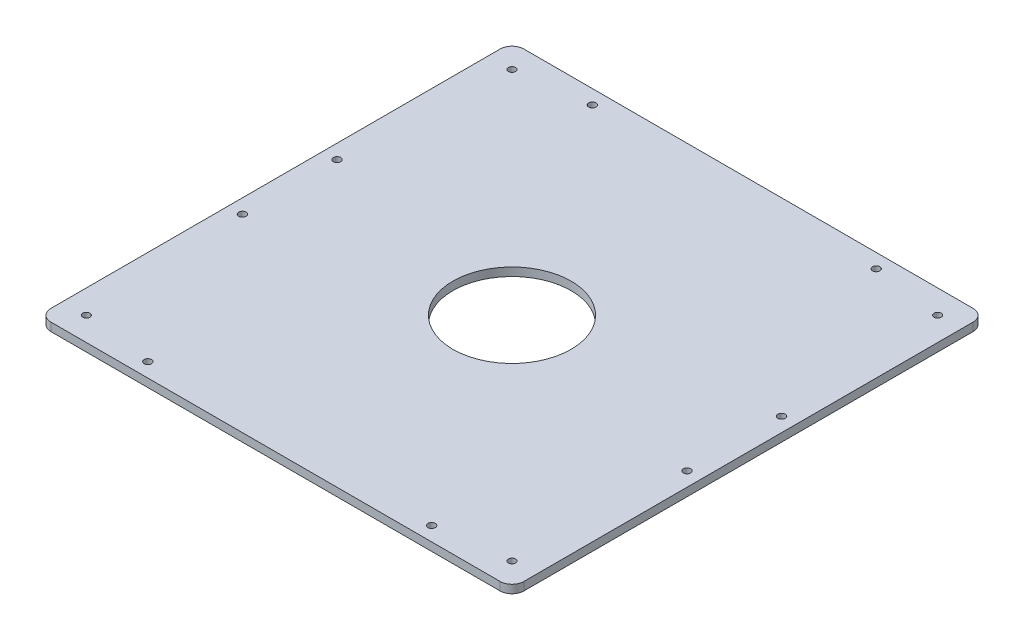
ISO-10303-21;
HEADER;
FILE_DESCRIPTION(('STEP AP214'),'2;1');
FILE_NAME('part.step','',(''),(''),'','','');
FILE_SCHEMA(('AUTOMOTIVE_DESIGN { 1 0 10303 214 1 1 1 1 }'));
ENDSEC;
DATA;
#1=APPLICATION_CONTEXT('core data for automotive mechanical design processes');
#2=APPLICATION_PROTOCOL_DEFINITION('international standard','automotive_design',2000,#1);
#3=PRODUCT_CONTEXT('',#1,'mechanical');
#4=PRODUCT('Part','Part','',(#3));
#5=PRODUCT_RELATED_PRODUCT_CATEGORY('part','',(#4));
#6=PRODUCT_DEFINITION_FORMATION('','',#4);
#7=PRODUCT_DEFINITION_CONTEXT('part definition',#1,'design');
#8=PRODUCT_DEFINITION('design','',#6,#7);
#9=PRODUCT_DEFINITION_SHAPE('','',#8);
#10=(LENGTH_UNIT() NAMED_UNIT(*) SI_UNIT(.MILLI.,.METRE.));
#11=(NAMED_UNIT(*) PLANE_ANGLE_UNIT() SI_UNIT($,.RADIAN.));
#12=(NAMED_UNIT(*) SI_UNIT($,.STERADIAN.) SOLID_ANGLE_UNIT());
#13=UNCERTAINTY_MEASURE_WITH_UNIT(LENGTH_MEASURE(1.E-05),#10,'distance_accuracy_value','');
#14=(GEOMETRIC_REPRESENTATION_CONTEXT(3) GLOBAL_UNCERTAINTY_ASSIGNED_CONTEXT((#13)) GLOBAL_UNIT_ASSIGNED_CONTEXT((#10,
#11,#12)) REPRESENTATION_CONTEXT('',''));
#15=CARTESIAN_POINT('',(0.,0.,0.));
#16=DIRECTION('',(0.,0.,1.));
#17=DIRECTION('',(1.,0.,0.));
#18=AXIS2_PLACEMENT_3D('',#15,#16,#17);
#19=CARTESIAN_POINT('',(0.,3.5,0.));
#20=DIRECTION('',(0.,1.,0.));
#21=DIRECTION('',(0.,0.,1.));
#22=AXIS2_PLACEMENT_3D('',#19,#20,#21);
#23=PLANE('',#22);
#24=CARTESIAN_POINT('',(-94.,3.5,-20.));
#25=DIRECTION('',(0.,1.,0.));
#26=DIRECTION('',(0.,0.,-1.));
#27=AXIS2_PLACEMENT_3D('',#24,#25,#26);
#28=CIRCLE('',#27,1.54999999999999);
#29=CARTESIAN_POINT('',(-94.,3.5,-21.55));
#30=VERTEX_POINT('',#29);
#31=EDGE_CURVE('E295',#30,#30,#28,.T.);
#32=ORIENTED_EDGE('',*,*,#31,.F.);
#33=EDGE_LOOP('',(#32));
#34=FACE_BOUND('',#33,.T.);
#35=CARTESIAN_POINT('',(-60.,3.5,94.));
#36=DIRECTION('',(0.,1.,0.));
#37=DIRECTION('',(0.,0.,-1.));
#38=AXIS2_PLACEMENT_3D('',#35,#36,#37);
#39=CIRCLE('',#38,1.54999999999999);
#40=CARTESIAN_POINT('',(-60.,3.5,92.45));
#41=VERTEX_POINT('',#40);
#42=EDGE_CURVE('E311',#41,#41,#39,.T.);
#43=ORIENTED_EDGE('',*,*,#42,.F.);
#44=EDGE_LOOP('',(#43));
#45=FACE_BOUND('',#44,.T.);
#46=CARTESIAN_POINT('',(94.,3.5,-20.));
#47=DIRECTION('',(0.,1.,0.));
#48=DIRECTION('',(0.,0.,1.));
#49=AXIS2_PLACEMENT_3D('',#46,#47,#48);
#50=CIRCLE('',#49,1.54999999999999);
#51=CARTESIAN_POINT('',(94.,3.5,-18.45));
#52=VERTEX_POINT('',#51);
#53=EDGE_CURVE('E327',#52,#52,#50,.T.);
#54=ORIENTED_EDGE('',*,*,#53,.F.);
#55=EDGE_LOOP('',(#54));
#56=FACE_BOUND('',#55,.T.);
#57=CARTESIAN_POINT('',(60.,3.5,-94.));
#58=DIRECTION('',(0.,1.,0.));
#59=DIRECTION('',(0.,0.,1.));
#60=AXIS2_PLACEMENT_3D('',#57,#58,#59);
#61=CIRCLE('',#60,1.55);
#62=CARTESIAN_POINT('',(60.,3.5,-92.45));
#63=VERTEX_POINT('',#62);
#64=EDGE_CURVE('E343',#63,#63,#61,.T.);
#65=ORIENTED_EDGE('',*,*,#64,.F.);
#66=EDGE_LOOP('',(#65));
#67=FACE_BOUND('',#66,.T.);
#68=CARTESIAN_POINT('',(90.,3.5,-90.));
#69=DIRECTION('',(0.,1.,0.));
#70=DIRECTION('',(0.,0.,1.));
#71=AXIS2_PLACEMENT_3D('',#68,#69,#70);
#72=CIRCLE('',#71,1.5);
#73=CARTESIAN_POINT('',(90.,3.5,-88.5));
#74=VERTEX_POINT('',#73);
#75=EDGE_CURVE('E359',#74,#74,#72,.T.);
#76=ORIENTED_EDGE('',*,*,#75,.F.);
#77=EDGE_LOOP('',(#76));
#78=FACE_BOUND('',#77,.T.);
#79=CARTESIAN_POINT('',(-90.,3.5,90.));
#80=DIRECTION('',(0.,1.,0.));
#81=DIRECTION('',(0.,0.,1.));
#82=AXIS2_PLACEMENT_3D('',#79,#80,#81);
#83=CIRCLE('',#82,1.5);
#84=CARTESIAN_POINT('',(-90.,3.5,91.5));
#85=VERTEX_POINT('',#84);
#86=EDGE_CURVE('E375',#85,#85,#83,.T.);
#87=ORIENTED_EDGE('',*,*,#86,.F.);
#88=EDGE_LOOP('',(#87));
#89=FACE_BOUND('',#88,.T.);
#90=DIRECTION('',(0.,0.,-1.));
#91=VECTOR('',#90,1.);
#92=CARTESIAN_POINT('',(99.9999999999982,3.5,80.6875383750505));
#93=LINE('',#92,#91);
#94=CARTESIAN_POINT('',(99.9999999999995,3.5,95.0000000000001));
#95=VERTEX_POINT('',#94);
#96=CARTESIAN_POINT('',(99.9999999999814,3.5,-95.));
#97=VERTEX_POINT('',#96);
#98=EDGE_CURVE('E183',#95,#97,#93,.T.);
#99=ORIENTED_EDGE('',*,*,#98,.T.);
#100=CARTESIAN_POINT('',(94.9999999999999,3.5,-95.));
#101=DIRECTION('',(0.,1.,0.));
#102=DIRECTION('',(0.,0.,1.));
#103=AXIS2_PLACEMENT_3D('',#100,#101,#102);
#104=CIRCLE('',#103,5.);
#105=CARTESIAN_POINT('',(94.9999999999999,3.5,-100.));
#106=VERTEX_POINT('',#105);
#107=EDGE_CURVE('E171',#97,#106,#104,.T.);
#108=ORIENTED_EDGE('',*,*,#107,.T.);
#109=DIRECTION('',(-1.,0.,0.));
#110=VECTOR('',#109,1.);
#111=CARTESIAN_POINT('',(-100.,3.5,-100.));
#112=LINE('',#111,#110);
#113=CARTESIAN_POINT('',(-94.9999999999999,3.5,-100.));
#114=VERTEX_POINT('',#113);
#115=EDGE_CURVE('E129',#106,#114,#112,.T.);
#116=ORIENTED_EDGE('',*,*,#115,.T.);
#117=CARTESIAN_POINT('',(-94.9999999999999,3.5,-95.));
#118=DIRECTION('',(0.,1.,0.));
#119=DIRECTION('',(0.,0.,1.));
#120=AXIS2_PLACEMENT_3D('',#117,#118,#119);
#121=CIRCLE('',#120,5.);
#122=CARTESIAN_POINT('',(-100.,3.5,-95.));
#123=VERTEX_POINT('',#122);
#124=EDGE_CURVE('E168',#114,#123,#121,.T.);
#125=ORIENTED_EDGE('',*,*,#124,.T.);
#126=DIRECTION('',(0.,0.,1.));
#127=VECTOR('',#126,1.);
#128=CARTESIAN_POINT('',(-100.,3.5,-100.));
#129=LINE('',#128,#127);
#130=CARTESIAN_POINT('',(-100.,3.5,95.));
#131=VERTEX_POINT('',#130);
#132=EDGE_CURVE('E138',#123,#131,#129,.T.);
#133=ORIENTED_EDGE('',*,*,#132,.T.);
#134=CARTESIAN_POINT('',(-95.,3.5,95.));
#135=DIRECTION('',(0.,1.,0.));
#136=DIRECTION('',(0.,0.,1.));
#137=AXIS2_PLACEMENT_3D('',#134,#135,#136);
#138=CIRCLE('',#137,5.);
#139=CARTESIAN_POINT('',(-95.,3.5,100.));
#140=VERTEX_POINT('',#139);
#141=EDGE_CURVE('E63',#131,#140,#138,.T.);
#142=ORIENTED_EDGE('',*,*,#141,.T.);
#143=DIRECTION('',(1.,0.,0.));
#144=VECTOR('',#143,1.);
#145=CARTESIAN_POINT('',(-100.,3.5,100.));
#146=LINE('',#145,#144);
#147=CARTESIAN_POINT('',(94.9999999999973,3.5,100.));
#148=VERTEX_POINT('',#147);
#149=EDGE_CURVE('E143',#140,#148,#146,.T.);
#150=ORIENTED_EDGE('',*,*,#149,.T.);
#151=CARTESIAN_POINT('',(94.9999999999973,3.5,95.));
#152=DIRECTION('',(0.,1.,0.));
#153=DIRECTION('',(0.,0.,1.));
#154=AXIS2_PLACEMENT_3D('',#151,#152,#153);
#155=CIRCLE('',#154,5.);
#156=EDGE_CURVE('E163',#148,#95,#155,.T.);
#157=ORIENTED_EDGE('',*,*,#156,.T.);
#158=EDGE_LOOP('',(#99,#108,#116,#125,#133,#142,#150,#157));
#159=FACE_BOUND('',#158,.T.);
#160=CARTESIAN_POINT('',(0.,3.5,0.));
#161=DIRECTION('',(0.,1.,0.));
#162=DIRECTION('',(0.,0.,1.));
#163=AXIS2_PLACEMENT_3D('',#160,#161,#162);
#164=CIRCLE('',#163,25.);
#165=CARTESIAN_POINT('',(0.,3.5,25.));
#166=VERTEX_POINT('',#165);
#167=EDGE_CURVE('E195',#166,#166,#164,.T.);
#168=ORIENTED_EDGE('',*,*,#167,.F.);
#169=EDGE_LOOP('',(#168));
#170=FACE_BOUND('',#169,.T.);
#171=CARTESIAN_POINT('',(-90.,3.5,-90.));
#172=DIRECTION('',(0.,1.,0.));
#173=DIRECTION('',(0.,0.,-1.));
#174=AXIS2_PLACEMENT_3D('',#171,#172,#173);
#175=CIRCLE('',#174,1.5);
#176=CARTESIAN_POINT('',(-90.,3.5,-91.5));
#177=VERTEX_POINT('',#176);
#178=EDGE_CURVE('E367',#177,#177,#175,.T.);
#179=ORIENTED_EDGE('',*,*,#178,.F.);
#180=EDGE_LOOP('',(#179));
#181=FACE_BOUND('',#180,.T.);
#182=CARTESIAN_POINT('',(90.,3.5,90.));
#183=DIRECTION('',(0.,1.,0.));
#184=DIRECTION('',(0.,0.,-1.));
#185=AXIS2_PLACEMENT_3D('',#182,#183,#184);
#186=CIRCLE('',#185,1.5);
#187=CARTESIAN_POINT('',(90.,3.5,88.5));
#188=VERTEX_POINT('',#187);
#189=EDGE_CURVE('E351',#188,#188,#186,.T.);
#190=ORIENTED_EDGE('',*,*,#189,.F.);
#191=EDGE_LOOP('',(#190));
#192=FACE_BOUND('',#191,.T.);
#193=CARTESIAN_POINT('',(60.,3.5,94.));
#194=DIRECTION('',(0.,1.,0.));
#195=DIRECTION('',(0.,0.,1.));
#196=AXIS2_PLACEMENT_3D('',#193,#194,#195);
#197=CIRCLE('',#196,1.55);
#198=CARTESIAN_POINT('',(60.,3.5,95.55));
#199=VERTEX_POINT('',#198);
#200=EDGE_CURVE('E335',#199,#199,#197,.T.);
#201=ORIENTED_EDGE('',*,*,#200,.F.);
#202=EDGE_LOOP('',(#201));
#203=FACE_BOUND('',#202,.T.);
#204=CARTESIAN_POINT('',(94.,3.5,20.));
#205=DIRECTION('',(0.,1.,0.));
#206=DIRECTION('',(0.,0.,-1.));
#207=AXIS2_PLACEMENT_3D('',#204,#205,#206);
#208=CIRCLE('',#207,1.54999999999999);
#209=CARTESIAN_POINT('',(94.,3.5,18.45));
#210=VERTEX_POINT('',#209);
#211=EDGE_CURVE('E319',#210,#210,#208,.T.);
#212=ORIENTED_EDGE('',*,*,#211,.F.);
#213=EDGE_LOOP('',(#212));
#214=FACE_BOUND('',#213,.T.);
#215=CARTESIAN_POINT('',(-94.,3.5,20.));
#216=DIRECTION('',(0.,1.,0.));
#217=DIRECTION('',(0.,0.,1.));
#218=AXIS2_PLACEMENT_3D('',#215,#216,#217);
#219=CIRCLE('',#218,1.54999999999999);
#220=CARTESIAN_POINT('',(-94.,3.5,21.55));
#221=VERTEX_POINT('',#220);
#222=EDGE_CURVE('E303',#221,#221,#219,.T.);
#223=ORIENTED_EDGE('',*,*,#222,.F.);
#224=EDGE_LOOP('',(#223));
#225=FACE_BOUND('',#224,.T.);
#226=CARTESIAN_POINT('',(-60.,3.5,-94.));
#227=DIRECTION('',(0.,1.,0.));
#228=DIRECTION('',(0.,0.,-1.));
#229=AXIS2_PLACEMENT_3D('',#226,#227,#228);
#230=CIRCLE('',#229,1.54999999999999);
#231=CARTESIAN_POINT('',(-60.,3.5,-95.55));
#232=VERTEX_POINT('',#231);
#233=EDGE_CURVE('E284',#232,#232,#230,.T.);
#234=ORIENTED_EDGE('',*,*,#233,.F.);
#235=EDGE_LOOP('',(#234));
#236=FACE_BOUND('',#235,.T.);
#237=ADVANCED_FACE('F41',(#34,#45,#56,#67,#78,#89,#159,#170,#181,#192,#203,#214,#225,#236),#23,.T.);
#238=CARTESIAN_POINT('',(0.,0.,0.));
#239=DIRECTION('',(0.,1.,0.));
#240=DIRECTION('',(0.,0.,1.));
#241=AXIS2_PLACEMENT_3D('',#238,#239,#240);
#242=PLANE('',#241);
#243=DIRECTION('',(-1.,0.,0.));
#244=VECTOR('',#243,1.);
#245=CARTESIAN_POINT('',(-100.,0.,-100.));
#246=LINE('',#245,#244);
#247=CARTESIAN_POINT('',(94.9999999999999,0.,-100.));
#248=VERTEX_POINT('',#247);
#249=CARTESIAN_POINT('',(-94.9999999999999,0.,-100.));
#250=VERTEX_POINT('',#249);
#251=EDGE_CURVE('E126',#248,#250,#246,.T.);
#252=ORIENTED_EDGE('',*,*,#251,.F.);
#253=CARTESIAN_POINT('',(94.9999999999999,0.,-95.));
#254=DIRECTION('',(0.,1.,0.));
#255=DIRECTION('',(0.,0.,1.));
#256=AXIS2_PLACEMENT_3D('',#253,#254,#255);
#257=CIRCLE('',#256,5.);
#258=CARTESIAN_POINT('',(99.9999999999999,0.,-95.));
#259=VERTEX_POINT('',#258);
#260=EDGE_CURVE('E108',#248,#259,#257,.F.);
#261=ORIENTED_EDGE('',*,*,#260,.T.);
#262=DIRECTION('',(0.,0.,-1.));
#263=VECTOR('',#262,1.);
#264=CARTESIAN_POINT('',(100.,0.,-100.));
#265=LINE('',#264,#263);
#266=CARTESIAN_POINT('',(99.9999999999973,0.,95.0000000000001));
#267=VERTEX_POINT('',#266);
#268=EDGE_CURVE('E139',#267,#259,#265,.T.);
#269=ORIENTED_EDGE('',*,*,#268,.F.);
#270=CARTESIAN_POINT('',(94.9999999999973,0.,95.));
#271=DIRECTION('',(0.,1.,0.));
#272=DIRECTION('',(0.,0.,1.));
#273=AXIS2_PLACEMENT_3D('',#270,#271,#272);
#274=CIRCLE('',#273,5.);
#275=CARTESIAN_POINT('',(94.9999999999973,0.,100.));
#276=VERTEX_POINT('',#275);
#277=EDGE_CURVE('E131',#267,#276,#274,.F.);
#278=ORIENTED_EDGE('',*,*,#277,.T.);
#279=DIRECTION('',(1.,0.,0.));
#280=VECTOR('',#279,1.);
#281=CARTESIAN_POINT('',(-100.,0.,100.));
#282=LINE('',#281,#280);
#283=CARTESIAN_POINT('',(-95.,0.,100.));
#284=VERTEX_POINT('',#283);
#285=EDGE_CURVE('E145',#284,#276,#282,.T.);
#286=ORIENTED_EDGE('',*,*,#285,.F.);
#287=CARTESIAN_POINT('',(-95.,0.,95.));
#288=DIRECTION('',(0.,1.,0.));
#289=DIRECTION('',(0.,0.,1.));
#290=AXIS2_PLACEMENT_3D('',#287,#288,#289);
#291=CIRCLE('',#290,5.);
#292=CARTESIAN_POINT('',(-100.,0.,95.));
#293=VERTEX_POINT('',#292);
#294=EDGE_CURVE('E153',#284,#293,#291,.F.);
#295=ORIENTED_EDGE('',*,*,#294,.T.);
#296=DIRECTION('',(0.,0.,1.));
#297=VECTOR('',#296,1.);
#298=CARTESIAN_POINT('',(-100.,0.,80.6875383750505));
#299=LINE('',#298,#297);
#300=CARTESIAN_POINT('',(-99.9999999999999,0.,-95.));
#301=VERTEX_POINT('',#300);
#302=EDGE_CURVE('E192',#301,#293,#299,.T.);
#303=ORIENTED_EDGE('',*,*,#302,.F.);
#304=CARTESIAN_POINT('',(-94.9999999999999,0.,-95.));
#305=DIRECTION('',(0.,1.,0.));
#306=DIRECTION('',(0.,0.,1.));
#307=AXIS2_PLACEMENT_3D('',#304,#305,#306);
#308=CIRCLE('',#307,5.);
#309=EDGE_CURVE('E120',#301,#250,#308,.F.);
#310=ORIENTED_EDGE('',*,*,#309,.T.);
#311=EDGE_LOOP('',(#252,#261,#269,#278,#286,#295,#303,#310));
#312=FACE_BOUND('',#311,.T.);
#313=CARTESIAN_POINT('',(0.,0.,0.));
#314=DIRECTION('',(0.,1.,0.));
#315=DIRECTION('',(0.,0.,1.));
#316=AXIS2_PLACEMENT_3D('',#313,#314,#315);
#317=CIRCLE('',#316,25.);
#318=CARTESIAN_POINT('',(0.,0.,25.));
#319=VERTEX_POINT('',#318);
#320=EDGE_CURVE('E379',#319,#319,#317,.T.);
#321=ORIENTED_EDGE('',*,*,#320,.T.);
#322=EDGE_LOOP('',(#321));
#323=FACE_BOUND('',#322,.T.);
#324=CARTESIAN_POINT('',(-90.,0.,90.));
#325=DIRECTION('',(0.,1.,0.));
#326=DIRECTION('',(0.,0.,1.));
#327=AXIS2_PLACEMENT_3D('',#324,#325,#326);
#328=CIRCLE('',#327,1.5);
#329=CARTESIAN_POINT('',(-90.,0.,91.5));
#330=VERTEX_POINT('',#329);
#331=EDGE_CURVE('E371',#330,#330,#328,.T.);
#332=ORIENTED_EDGE('',*,*,#331,.T.);
#333=EDGE_LOOP('',(#332));
#334=FACE_BOUND('',#333,.T.);
#335=CARTESIAN_POINT('',(-90.,0.,-90.));
#336=DIRECTION('',(0.,1.,0.));
#337=DIRECTION('',(0.,0.,-1.));
#338=AXIS2_PLACEMENT_3D('',#335,#336,#337);
#339=CIRCLE('',#338,1.5);
#340=CARTESIAN_POINT('',(-90.,0.,-91.5));
#341=VERTEX_POINT('',#340);
#342=EDGE_CURVE('E363',#341,#341,#339,.T.);
#343=ORIENTED_EDGE('',*,*,#342,.T.);
#344=EDGE_LOOP('',(#343));
#345=FACE_BOUND('',#344,.T.);
#346=CARTESIAN_POINT('',(90.,0.,-90.));
#347=DIRECTION('',(0.,1.,0.));
#348=DIRECTION('',(0.,0.,1.));
#349=AXIS2_PLACEMENT_3D('',#346,#347,#348);
#350=CIRCLE('',#349,1.5);
#351=CARTESIAN_POINT('',(90.,0.,-88.5));
#352=VERTEX_POINT('',#351);
#353=EDGE_CURVE('E355',#352,#352,#350,.T.);
#354=ORIENTED_EDGE('',*,*,#353,.T.);
#355=EDGE_LOOP('',(#354));
#356=FACE_BOUND('',#355,.T.);
#357=CARTESIAN_POINT('',(90.,0.,90.));
#358=DIRECTION('',(0.,1.,0.));
#359=DIRECTION('',(0.,0.,-1.));
#360=AXIS2_PLACEMENT_3D('',#357,#358,#359);
#361=CIRCLE('',#360,1.5);
#362=CARTESIAN_POINT('',(90.,0.,88.5));
#363=VERTEX_POINT('',#362);
#364=EDGE_CURVE('E347',#363,#363,#361,.T.);
#365=ORIENTED_EDGE('',*,*,#364,.T.);
#366=EDGE_LOOP('',(#365));
#367=FACE_BOUND('',#366,.T.);
#368=CARTESIAN_POINT('',(60.,0.,-94.));
#369=DIRECTION('',(0.,1.,0.));
#370=DIRECTION('',(0.,0.,1.));
#371=AXIS2_PLACEMENT_3D('',#368,#369,#370);
#372=CIRCLE('',#371,1.55);
#373=CARTESIAN_POINT('',(60.,0.,-92.45));
#374=VERTEX_POINT('',#373);
#375=EDGE_CURVE('E339',#374,#374,#372,.T.);
#376=ORIENTED_EDGE('',*,*,#375,.T.);
#377=EDGE_LOOP('',(#376));
#378=FACE_BOUND('',#377,.T.);
#379=CARTESIAN_POINT('',(60.,0.,94.));
#380=DIRECTION('',(0.,1.,0.));
#381=DIRECTION('',(0.,0.,1.));
#382=AXIS2_PLACEMENT_3D('',#379,#380,#381);
#383=CIRCLE('',#382,1.55);
#384=CARTESIAN_POINT('',(60.,0.,95.55));
#385=VERTEX_POINT('',#384);
#386=EDGE_CURVE('E331',#385,#385,#383,.T.);
#387=ORIENTED_EDGE('',*,*,#386,.T.);
#388=EDGE_LOOP('',(#387));
#389=FACE_BOUND('',#388,.T.);
#390=CARTESIAN_POINT('',(94.,0.,-20.));
#391=DIRECTION('',(0.,1.,0.));
#392=DIRECTION('',(0.,0.,1.));
#393=AXIS2_PLACEMENT_3D('',#390,#391,#392);
#394=CIRCLE('',#393,1.54999999999999);
#395=CARTESIAN_POINT('',(94.,0.,-18.45));
#396=VERTEX_POINT('',#395);
#397=EDGE_CURVE('E323',#396,#396,#394,.T.);
#398=ORIENTED_EDGE('',*,*,#397,.T.);
#399=EDGE_LOOP('',(#398));
#400=FACE_BOUND('',#399,.T.);
#401=CARTESIAN_POINT('',(94.,0.,20.));
#402=DIRECTION('',(0.,1.,0.));
#403=DIRECTION('',(0.,0.,-1.));
#404=AXIS2_PLACEMENT_3D('',#401,#402,#403);
#405=CIRCLE('',#404,1.54999999999999);
#406=CARTESIAN_POINT('',(94.,0.,18.45));
#407=VERTEX_POINT('',#406);
#408=EDGE_CURVE('E315',#407,#407,#405,.T.);
#409=ORIENTED_EDGE('',*,*,#408,.T.);
#410=EDGE_LOOP('',(#409));
#411=FACE_BOUND('',#410,.T.);
#412=CARTESIAN_POINT('',(-60.,0.,94.));
#413=DIRECTION('',(0.,1.,0.));
#414=DIRECTION('',(0.,0.,-1.));
#415=AXIS2_PLACEMENT_3D('',#412,#413,#414);
#416=CIRCLE('',#415,1.54999999999999);
#417=CARTESIAN_POINT('',(-60.,0.,92.45));
#418=VERTEX_POINT('',#417);
#419=EDGE_CURVE('E307',#418,#418,#416,.T.);
#420=ORIENTED_EDGE('',*,*,#419,.T.);
#421=EDGE_LOOP('',(#420));
#422=FACE_BOUND('',#421,.T.);
#423=CARTESIAN_POINT('',(-94.,0.,20.));
#424=DIRECTION('',(0.,1.,0.));
#425=DIRECTION('',(0.,0.,1.));
#426=AXIS2_PLACEMENT_3D('',#423,#424,#425);
#427=CIRCLE('',#426,1.54999999999999);
#428=CARTESIAN_POINT('',(-94.,0.,21.55));
#429=VERTEX_POINT('',#428);
#430=EDGE_CURVE('E299',#429,#429,#427,.T.);
#431=ORIENTED_EDGE('',*,*,#430,.T.);
#432=EDGE_LOOP('',(#431));
#433=FACE_BOUND('',#432,.T.);
#434=CARTESIAN_POINT('',(-94.,0.,-20.));
#435=DIRECTION('',(0.,1.,0.));
#436=DIRECTION('',(0.,0.,-1.));
#437=AXIS2_PLACEMENT_3D('',#434,#435,#436);
#438=CIRCLE('',#437,1.54999999999999);
#439=CARTESIAN_POINT('',(-94.,0.,-21.55));
#440=VERTEX_POINT('',#439);
#441=EDGE_CURVE('E292',#440,#440,#438,.T.);
#442=ORIENTED_EDGE('',*,*,#441,.T.);
#443=EDGE_LOOP('',(#442));
#444=FACE_BOUND('',#443,.T.);
#445=CARTESIAN_POINT('',(-60.,0.,-94.));
#446=DIRECTION('',(0.,1.,0.));
#447=DIRECTION('',(0.,0.,-1.));
#448=AXIS2_PLACEMENT_3D('',#445,#446,#447);
#449=CIRCLE('',#448,1.54999999999999);
#450=CARTESIAN_POINT('',(-60.,0.,-95.55));
#451=VERTEX_POINT('',#450);
#452=EDGE_CURVE('E287',#451,#451,#449,.T.);
#453=ORIENTED_EDGE('',*,*,#452,.T.);
#454=EDGE_LOOP('',(#453));
#455=FACE_BOUND('',#454,.T.);
#456=ADVANCED_FACE('F134',(#312,#323,#334,#345,#356,#367,#378,#389,#400,#411,#422,#433,#444,
#455),#242,.F.);
#457=CARTESIAN_POINT('',(-100.,3.5,80.6875383750505));
#458=DIRECTION('',(1.,0.,0.));
#459=DIRECTION('',(0.,0.,-1.));
#460=AXIS2_PLACEMENT_3D('',#457,#458,#459);
#461=PLANE('',#460);
#462=ORIENTED_EDGE('',*,*,#132,.F.);
#463=DIRECTION('',(0.,-1.,0.));
#464=VECTOR('',#463,1.);
#465=CARTESIAN_POINT('',(-99.9999999999999,3.5,-95.));
#466=LINE('',#465,#464);
#467=EDGE_CURVE('E177',#123,#301,#466,.T.);
#468=ORIENTED_EDGE('',*,*,#467,.T.);
#469=ORIENTED_EDGE('',*,*,#302,.T.);
#470=DIRECTION('',(0.,-1.,0.));
#471=VECTOR('',#470,1.);
#472=CARTESIAN_POINT('',(-100.,3.5,95.));
#473=LINE('',#472,#471);
#474=EDGE_CURVE('E174',#293,#131,#473,.F.);
#475=ORIENTED_EDGE('',*,*,#474,.T.);
#476=EDGE_LOOP('',(#462,#468,#469,#475));
#477=FACE_BOUND('',#476,.T.);
#478=ADVANCED_FACE('F214',(#477),#461,.F.);
#479=CARTESIAN_POINT('',(-100.,3.5,100.));
#480=DIRECTION('',(0.,0.,-1.));
#481=DIRECTION('',(-1.,0.,0.));
#482=AXIS2_PLACEMENT_3D('',#479,#480,#481);
#483=PLANE('',#482);
#484=ORIENTED_EDGE('',*,*,#149,.F.);
#485=DIRECTION('',(0.,-1.,0.));
#486=VECTOR('',#485,1.);
#487=CARTESIAN_POINT('',(-95.,3.5,100.));
#488=LINE('',#487,#486);
#489=EDGE_CURVE('E11',#140,#284,#488,.T.);
#490=ORIENTED_EDGE('',*,*,#489,.T.);
#491=ORIENTED_EDGE('',*,*,#285,.T.);
#492=DIRECTION('',(0.,-1.,0.));
#493=VECTOR('',#492,1.);
#494=CARTESIAN_POINT('',(94.9999999999973,3.5,100.));
#495=LINE('',#494,#493);
#496=EDGE_CURVE('E50',#276,#148,#495,.F.);
#497=ORIENTED_EDGE('',*,*,#496,.T.);
#498=EDGE_LOOP('',(#484,#490,#491,#497));
#499=FACE_BOUND('',#498,.T.);
#500=ADVANCED_FACE('F198',(#499),#483,.F.);
#501=CARTESIAN_POINT('',(100.,3.5,-100.));
#502=DIRECTION('',(-1.,0.,0.));
#503=DIRECTION('',(0.,0.,1.));
#504=AXIS2_PLACEMENT_3D('',#501,#502,#503);
#505=PLANE('',#504);
#506=ORIENTED_EDGE('',*,*,#268,.T.);
#507=DIRECTION('',(0.,-1.,0.));
#508=VECTOR('',#507,1.);
#509=CARTESIAN_POINT('',(99.9999999999999,3.5,-95.));
#510=LINE('',#509,#508);
#511=EDGE_CURVE('E113',#259,#97,#510,.F.);
#512=ORIENTED_EDGE('',*,*,#511,.T.);
#513=ORIENTED_EDGE('',*,*,#98,.F.);
#514=DIRECTION('',(0.,-1.,0.));
#515=VECTOR('',#514,1.);
#516=CARTESIAN_POINT('',(99.9999999999973,3.5,95.0000000000001));
#517=LINE('',#516,#515);
#518=EDGE_CURVE('E119',#95,#267,#517,.T.);
#519=ORIENTED_EDGE('',*,*,#518,.T.);
#520=EDGE_LOOP('',(#506,#512,#513,#519));
#521=FACE_BOUND('',#520,.T.);
#522=ADVANCED_FACE('F205',(#521),#505,.F.);
#523=CARTESIAN_POINT('',(-100.,3.5,-100.));
#524=DIRECTION('',(0.,0.,1.));
#525=DIRECTION('',(1.,0.,0.));
#526=AXIS2_PLACEMENT_3D('',#523,#524,#525);
#527=PLANE('',#526);
#528=ORIENTED_EDGE('',*,*,#115,.F.);
#529=DIRECTION('',(0.,-1.,0.));
#530=VECTOR('',#529,1.);
#531=CARTESIAN_POINT('',(94.9999999999999,3.5,-100.));
#532=LINE('',#531,#530);
#533=EDGE_CURVE('E112',#106,#248,#532,.T.);
#534=ORIENTED_EDGE('',*,*,#533,.T.);
#535=ORIENTED_EDGE('',*,*,#251,.T.);
#536=DIRECTION('',(0.,-1.,0.));
#537=VECTOR('',#536,1.);
#538=CARTESIAN_POINT('',(-94.9999999999999,3.5,-100.));
#539=LINE('',#538,#537);
#540=EDGE_CURVE('E132',#250,#114,#539,.F.);
#541=ORIENTED_EDGE('',*,*,#540,.T.);
#542=EDGE_LOOP('',(#528,#534,#535,#541));
#543=FACE_BOUND('',#542,.T.);
#544=ADVANCED_FACE('F125',(#543),#527,.F.);
#545=CARTESIAN_POINT('',(0.,3.5,0.));
#546=DIRECTION('',(0.,-1.,0.));
#547=DIRECTION('',(0.,0.,-1.));
#548=AXIS2_PLACEMENT_3D('',#545,#546,#547);
#549=CYLINDRICAL_SURFACE('',#548,25.);
#550=ORIENTED_EDGE('',*,*,#167,.T.);
#551=EDGE_LOOP('',(#550));
#552=FACE_BOUND('',#551,.T.);
#553=ORIENTED_EDGE('',*,*,#320,.F.);
#554=EDGE_LOOP('',(#553));
#555=FACE_BOUND('',#554,.T.);
#556=ADVANCED_FACE('F212',(#552,#555),#549,.F.);
#557=CARTESIAN_POINT('',(-90.,3.5,90.));
#558=DIRECTION('',(0.,-1.,0.));
#559=DIRECTION('',(0.,0.,-1.));
#560=AXIS2_PLACEMENT_3D('',#557,#558,#559);
#561=CYLINDRICAL_SURFACE('',#560,1.5);
#562=ORIENTED_EDGE('',*,*,#86,.T.);
#563=EDGE_LOOP('',(#562));
#564=FACE_BOUND('',#563,.T.);
#565=ORIENTED_EDGE('',*,*,#331,.F.);
#566=EDGE_LOOP('',(#565));
#567=FACE_BOUND('',#566,.T.);
#568=ADVANCED_FACE('F228',(#564,#567),#561,.F.);
#569=CARTESIAN_POINT('',(-90.,3.5,-90.));
#570=DIRECTION('',(0.,-1.,0.));
#571=DIRECTION('',(0.,0.,-1.));
#572=AXIS2_PLACEMENT_3D('',#569,#570,#571);
#573=CYLINDRICAL_SURFACE('',#572,1.5);
#574=ORIENTED_EDGE('',*,*,#178,.T.);
#575=EDGE_LOOP('',(#574));
#576=FACE_BOUND('',#575,.T.);
#577=ORIENTED_EDGE('',*,*,#342,.F.);
#578=EDGE_LOOP('',(#577));
#579=FACE_BOUND('',#578,.T.);
#580=ADVANCED_FACE('F232',(#576,#579),#573,.F.);
#581=CARTESIAN_POINT('',(90.,3.5,-90.));
#582=DIRECTION('',(0.,-1.,0.));
#583=DIRECTION('',(0.,0.,-1.));
#584=AXIS2_PLACEMENT_3D('',#581,#582,#583);
#585=CYLINDRICAL_SURFACE('',#584,1.5);
#586=ORIENTED_EDGE('',*,*,#75,.T.);
#587=EDGE_LOOP('',(#586));
#588=FACE_BOUND('',#587,.T.);
#589=ORIENTED_EDGE('',*,*,#353,.F.);
#590=EDGE_LOOP('',(#589));
#591=FACE_BOUND('',#590,.T.);
#592=ADVANCED_FACE('F236',(#588,#591),#585,.F.);
#593=CARTESIAN_POINT('',(90.,3.5,90.));
#594=DIRECTION('',(0.,-1.,0.));
#595=DIRECTION('',(0.,0.,-1.));
#596=AXIS2_PLACEMENT_3D('',#593,#594,#595);
#597=CYLINDRICAL_SURFACE('',#596,1.5);
#598=ORIENTED_EDGE('',*,*,#189,.T.);
#599=EDGE_LOOP('',(#598));
#600=FACE_BOUND('',#599,.T.);
#601=ORIENTED_EDGE('',*,*,#364,.F.);
#602=EDGE_LOOP('',(#601));
#603=FACE_BOUND('',#602,.T.);
#604=ADVANCED_FACE('F240',(#600,#603),#597,.F.);
#605=CARTESIAN_POINT('',(60.,3.5,-94.));
#606=DIRECTION('',(0.,-1.,0.));
#607=DIRECTION('',(0.,0.,-1.));
#608=AXIS2_PLACEMENT_3D('',#605,#606,#607);
#609=CYLINDRICAL_SURFACE('',#608,1.55);
#610=ORIENTED_EDGE('',*,*,#64,.T.);
#611=EDGE_LOOP('',(#610));
#612=FACE_BOUND('',#611,.T.);
#613=ORIENTED_EDGE('',*,*,#375,.F.);
#614=EDGE_LOOP('',(#613));
#615=FACE_BOUND('',#614,.T.);
#616=ADVANCED_FACE('F244',(#612,#615),#609,.F.);
#617=CARTESIAN_POINT('',(60.,3.5,94.));
#618=DIRECTION('',(0.,-1.,0.));
#619=DIRECTION('',(0.,0.,-1.));
#620=AXIS2_PLACEMENT_3D('',#617,#618,#619);
#621=CYLINDRICAL_SURFACE('',#620,1.55);
#622=ORIENTED_EDGE('',*,*,#200,.T.);
#623=EDGE_LOOP('',(#622));
#624=FACE_BOUND('',#623,.T.);
#625=ORIENTED_EDGE('',*,*,#386,.F.);
#626=EDGE_LOOP('',(#625));
#627=FACE_BOUND('',#626,.T.);
#628=ADVANCED_FACE('F248',(#624,#627),#621,.F.);
#629=CARTESIAN_POINT('',(94.,3.5,-20.));
#630=DIRECTION('',(0.,-1.,0.));
#631=DIRECTION('',(0.,0.,-1.));
#632=AXIS2_PLACEMENT_3D('',#629,#630,#631);
#633=CYLINDRICAL_SURFACE('',#632,1.54999999999999);
#634=ORIENTED_EDGE('',*,*,#53,.T.);
#635=EDGE_LOOP('',(#634));
#636=FACE_BOUND('',#635,.T.);
#637=ORIENTED_EDGE('',*,*,#397,.F.);
#638=EDGE_LOOP('',(#637));
#639=FACE_BOUND('',#638,.T.);
#640=ADVANCED_FACE('F252',(#636,#639),#633,.F.);
#641=CARTESIAN_POINT('',(94.,3.5,20.));
#642=DIRECTION('',(0.,-1.,0.));
#643=DIRECTION('',(0.,0.,-1.));
#644=AXIS2_PLACEMENT_3D('',#641,#642,#643);
#645=CYLINDRICAL_SURFACE('',#644,1.54999999999999);
#646=ORIENTED_EDGE('',*,*,#211,.T.);
#647=EDGE_LOOP('',(#646));
#648=FACE_BOUND('',#647,.T.);
#649=ORIENTED_EDGE('',*,*,#408,.F.);
#650=EDGE_LOOP('',(#649));
#651=FACE_BOUND('',#650,.T.);
#652=ADVANCED_FACE('F256',(#648,#651),#645,.F.);
#653=CARTESIAN_POINT('',(-60.,3.5,94.));
#654=DIRECTION('',(0.,-1.,0.));
#655=DIRECTION('',(0.,0.,-1.));
#656=AXIS2_PLACEMENT_3D('',#653,#654,#655);
#657=CYLINDRICAL_SURFACE('',#656,1.54999999999999);
#658=ORIENTED_EDGE('',*,*,#42,.T.);
#659=EDGE_LOOP('',(#658));
#660=FACE_BOUND('',#659,.T.);
#661=ORIENTED_EDGE('',*,*,#419,.F.);
#662=EDGE_LOOP('',(#661));
#663=FACE_BOUND('',#662,.T.);
#664=ADVANCED_FACE('F260',(#660,#663),#657,.F.);
#665=CARTESIAN_POINT('',(-94.,3.5,20.));
#666=DIRECTION('',(0.,-1.,0.));
#667=DIRECTION('',(0.,0.,-1.));
#668=AXIS2_PLACEMENT_3D('',#665,#666,#667);
#669=CYLINDRICAL_SURFACE('',#668,1.54999999999999);
#670=ORIENTED_EDGE('',*,*,#222,.T.);
#671=EDGE_LOOP('',(#670));
#672=FACE_BOUND('',#671,.T.);
#673=ORIENTED_EDGE('',*,*,#430,.F.);
#674=EDGE_LOOP('',(#673));
#675=FACE_BOUND('',#674,.T.);
#676=ADVANCED_FACE('F264',(#672,#675),#669,.F.);
#677=CARTESIAN_POINT('',(-94.,3.5,-20.));
#678=DIRECTION('',(0.,-1.,0.));
#679=DIRECTION('',(0.,0.,-1.));
#680=AXIS2_PLACEMENT_3D('',#677,#678,#679);
#681=CYLINDRICAL_SURFACE('',#680,1.54999999999999);
#682=ORIENTED_EDGE('',*,*,#31,.T.);
#683=EDGE_LOOP('',(#682));
#684=FACE_BOUND('',#683,.T.);
#685=ORIENTED_EDGE('',*,*,#441,.F.);
#686=EDGE_LOOP('',(#685));
#687=FACE_BOUND('',#686,.T.);
#688=ADVANCED_FACE('F268',(#684,#687),#681,.F.);
#689=CARTESIAN_POINT('',(-60.,3.5,-94.));
#690=DIRECTION('',(0.,-1.,0.));
#691=DIRECTION('',(0.,0.,-1.));
#692=AXIS2_PLACEMENT_3D('',#689,#690,#691);
#693=CYLINDRICAL_SURFACE('',#692,1.54999999999999);
#694=ORIENTED_EDGE('',*,*,#233,.T.);
#695=EDGE_LOOP('',(#694));
#696=FACE_BOUND('',#695,.T.);
#697=ORIENTED_EDGE('',*,*,#452,.F.);
#698=EDGE_LOOP('',(#697));
#699=FACE_BOUND('',#698,.T.);
#700=ADVANCED_FACE('F272',(#696,#699),#693,.F.);
#701=CARTESIAN_POINT('',(94.9999999999999,3.5,-95.));
#702=DIRECTION('',(0.,-1.,0.));
#703=DIRECTION('',(0.,0.,-1.));
#704=AXIS2_PLACEMENT_3D('',#701,#702,#703);
#705=CYLINDRICAL_SURFACE('',#704,5.);
#706=ORIENTED_EDGE('',*,*,#107,.F.);
#707=ORIENTED_EDGE('',*,*,#511,.F.);
#708=ORIENTED_EDGE('',*,*,#260,.F.);
#709=ORIENTED_EDGE('',*,*,#533,.F.);
#710=EDGE_LOOP('',(#706,#707,#708,#709));
#711=FACE_BOUND('',#710,.T.);
#712=ADVANCED_FACE('F111',(#711),#705,.T.);
#713=CARTESIAN_POINT('',(-94.9999999999999,3.5,-95.));
#714=DIRECTION('',(0.,-1.,0.));
#715=DIRECTION('',(0.,0.,-1.));
#716=AXIS2_PLACEMENT_3D('',#713,#714,#715);
#717=CYLINDRICAL_SURFACE('',#716,5.);
#718=ORIENTED_EDGE('',*,*,#124,.F.);
#719=ORIENTED_EDGE('',*,*,#540,.F.);
#720=ORIENTED_EDGE('',*,*,#309,.F.);
#721=ORIENTED_EDGE('',*,*,#467,.F.);
#722=EDGE_LOOP('',(#718,#719,#720,#721));
#723=FACE_BOUND('',#722,.T.);
#724=ADVANCED_FACE('F279',(#723),#717,.T.);
#725=CARTESIAN_POINT('',(-95.,3.5,95.));
#726=DIRECTION('',(0.,-1.,0.));
#727=DIRECTION('',(0.,0.,-1.));
#728=AXIS2_PLACEMENT_3D('',#725,#726,#727);
#729=CYLINDRICAL_SURFACE('',#728,5.);
#730=ORIENTED_EDGE('',*,*,#141,.F.);
#731=ORIENTED_EDGE('',*,*,#474,.F.);
#732=ORIENTED_EDGE('',*,*,#294,.F.);
#733=ORIENTED_EDGE('',*,*,#489,.F.);
#734=EDGE_LOOP('',(#730,#731,#732,#733));
#735=FACE_BOUND('',#734,.T.);
#736=ADVANCED_FACE('F446',(#735),#729,.T.);
#737=CARTESIAN_POINT('',(94.9999999999973,3.5,95.));
#738=DIRECTION('',(0.,-1.,0.));
#739=DIRECTION('',(0.,0.,-1.));
#740=AXIS2_PLACEMENT_3D('',#737,#738,#739);
#741=CYLINDRICAL_SURFACE('',#740,5.);
#742=ORIENTED_EDGE('',*,*,#156,.F.);
#743=ORIENTED_EDGE('',*,*,#496,.F.);
#744=ORIENTED_EDGE('',*,*,#277,.F.);
#745=ORIENTED_EDGE('',*,*,#518,.F.);
#746=EDGE_LOOP('',(#742,#743,#744,#745));
#747=FACE_BOUND('',#746,.T.);
#748=ADVANCED_FACE('F43',(#747),#741,.T.);
#749=CLOSED_SHELL('',(#237,#456,#478,#500,#522,#544,#556,#568,#580,#592,#604,#616,#628,#640,
#652,#664,#676,#688,#700,#712,#724,#736,#748));
#750=MANIFOLD_SOLID_BREP('B2',#749);
#751=ADVANCED_BREP_SHAPE_REPRESENTATION('',(#18,#750),#14);
#752=SHAPE_DEFINITION_REPRESENTATION(#9,#751);
ENDSEC;
END-ISO-10303-21;
